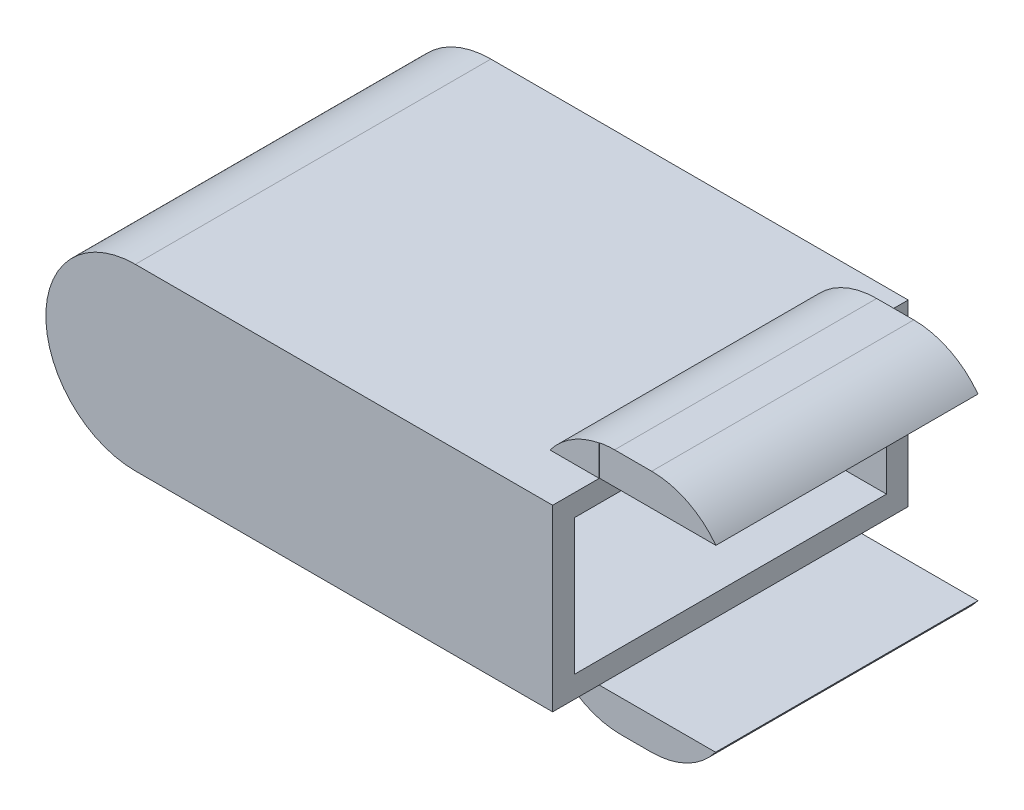
ISO-10303-21;
HEADER;
FILE_DESCRIPTION(('STEP AP214'),'2;1');
FILE_NAME('part.step','',(''),(''),'','','');
FILE_SCHEMA(('AUTOMOTIVE_DESIGN { 1 0 10303 214 1 1 1 1 }'));
ENDSEC;
DATA;
#1=APPLICATION_CONTEXT('core data for automotive mechanical design processes');
#2=APPLICATION_PROTOCOL_DEFINITION('international standard','automotive_design',2000,#1);
#3=PRODUCT_CONTEXT('',#1,'mechanical');
#4=PRODUCT('Part','Part','',(#3));
#5=PRODUCT_RELATED_PRODUCT_CATEGORY('part','',(#4));
#6=PRODUCT_DEFINITION_FORMATION('','',#4);
#7=PRODUCT_DEFINITION_CONTEXT('part definition',#1,'design');
#8=PRODUCT_DEFINITION('design','',#6,#7);
#9=PRODUCT_DEFINITION_SHAPE('','',#8);
#10=(LENGTH_UNIT() NAMED_UNIT(*) SI_UNIT(.MILLI.,.METRE.));
#11=(NAMED_UNIT(*) PLANE_ANGLE_UNIT() SI_UNIT($,.RADIAN.));
#12=(NAMED_UNIT(*) SI_UNIT($,.STERADIAN.) SOLID_ANGLE_UNIT());
#13=UNCERTAINTY_MEASURE_WITH_UNIT(LENGTH_MEASURE(1.E-05),#10,'distance_accuracy_value','');
#14=(GEOMETRIC_REPRESENTATION_CONTEXT(3) GLOBAL_UNCERTAINTY_ASSIGNED_CONTEXT((#13)) GLOBAL_UNIT_ASSIGNED_CONTEXT((#10,
#11,#12)) REPRESENTATION_CONTEXT('',''));
#15=CARTESIAN_POINT('',(0.,0.,0.));
#16=DIRECTION('',(0.,0.,1.));
#17=DIRECTION('',(1.,0.,0.));
#18=AXIS2_PLACEMENT_3D('',#15,#16,#17);
#19=CARTESIAN_POINT('',(18.2408360128617,22.3,-22.15));
#20=DIRECTION('',(-1.,0.,0.));
#21=DIRECTION('',(0.,0.,1.));
#22=AXIS2_PLACEMENT_3D('',#19,#20,#21);
#23=PLANE('',#22);
#24=DIRECTION('',(0.,0.,1.));
#25=VECTOR('',#24,1.);
#26=CARTESIAN_POINT('',(18.2408360128618,19.6,19.45));
#27=LINE('',#26,#25);
#28=CARTESIAN_POINT('',(18.2408360128617,19.6,-19.45));
#29=VERTEX_POINT('',#28);
#30=CARTESIAN_POINT('',(18.2408360128618,19.6,19.45));
#31=VERTEX_POINT('',#30);
#32=EDGE_CURVE('E249',#29,#31,#27,.T.);
#33=ORIENTED_EDGE('',*,*,#32,.F.);
#34=DIRECTION('',(0.,1.,0.));
#35=VECTOR('',#34,1.);
#36=CARTESIAN_POINT('',(18.2408360128617,2.7,-19.45));
#37=LINE('',#36,#35);
#38=CARTESIAN_POINT('',(18.2408360128617,2.7,-19.45));
#39=VERTEX_POINT('',#38);
#40=EDGE_CURVE('E231',#39,#29,#37,.T.);
#41=ORIENTED_EDGE('',*,*,#40,.F.);
#42=DIRECTION('',(0.,0.,-1.));
#43=VECTOR('',#42,1.);
#44=CARTESIAN_POINT('',(18.2408360128618,2.7,19.45));
#45=LINE('',#44,#43);
#46=CARTESIAN_POINT('',(18.2408360128618,2.7,19.45));
#47=VERTEX_POINT('',#46);
#48=EDGE_CURVE('E238',#47,#39,#45,.T.);
#49=ORIENTED_EDGE('',*,*,#48,.F.);
#50=DIRECTION('',(0.,-1.,0.));
#51=VECTOR('',#50,1.);
#52=CARTESIAN_POINT('',(18.2408360128618,2.7,19.45));
#53=LINE('',#52,#51);
#54=EDGE_CURVE('E252',#31,#47,#53,.T.);
#55=ORIENTED_EDGE('',*,*,#54,.F.);
#56=EDGE_LOOP('',(#33,#41,#49,#55));
#57=FACE_BOUND('',#56,.T.);
#58=DIRECTION('',(0.,-1.,0.));
#59=VECTOR('',#58,1.);
#60=CARTESIAN_POINT('',(18.2408360128618,22.3,16.3102911130721));
#61=LINE('',#60,#59);
#62=CARTESIAN_POINT('',(18.2408360128618,26.1221908407786,16.3102911130721));
#63=VERTEX_POINT('',#62);
#64=CARTESIAN_POINT('',(18.2408360128618,22.3,16.3102911130721));
#65=VERTEX_POINT('',#64);
#66=EDGE_CURVE('E185',#63,#65,#61,.T.);
#67=ORIENTED_EDGE('',*,*,#66,.F.);
#68=DIRECTION('',(0.,0.,-1.));
#69=VECTOR('',#68,1.);
#70=CARTESIAN_POINT('',(18.2408360128618,26.1221908407786,16.3102911130721));
#71=LINE('',#70,#69);
#72=CARTESIAN_POINT('',(18.2408360128618,26.1221908407786,16.35));
#73=VERTEX_POINT('',#72);
#74=EDGE_CURVE('E305',#63,#73,#71,.F.);
#75=ORIENTED_EDGE('',*,*,#74,.T.);
#76=DIRECTION('',(0.,-1.,0.));
#77=VECTOR('',#76,1.);
#78=CARTESIAN_POINT('',(18.2408360128618,26.3,16.35));
#79=LINE('',#78,#77);
#80=CARTESIAN_POINT('',(18.2408360128618,22.3,16.35));
#81=VERTEX_POINT('',#80);
#82=EDGE_CURVE('E193',#73,#81,#79,.T.);
#83=ORIENTED_EDGE('',*,*,#82,.T.);
#84=DIRECTION('',(0.,0.,-1.));
#85=VECTOR('',#84,1.);
#86=CARTESIAN_POINT('',(18.2408360128617,22.3,-22.15));
#87=LINE('',#86,#85);
#88=CARTESIAN_POINT('',(18.2408360128618,22.3,22.15));
#89=VERTEX_POINT('',#88);
#90=EDGE_CURVE('E273',#89,#81,#87,.T.);
#91=ORIENTED_EDGE('',*,*,#90,.F.);
#92=DIRECTION('',(0.,-1.,0.));
#93=VECTOR('',#92,1.);
#94=CARTESIAN_POINT('',(18.2408360128618,22.3,22.15));
#95=LINE('',#94,#93);
#96=CARTESIAN_POINT('',(18.2408360128618,0.,22.15));
#97=VERTEX_POINT('',#96);
#98=EDGE_CURVE('E289',#89,#97,#95,.T.);
#99=ORIENTED_EDGE('',*,*,#98,.T.);
#100=DIRECTION('',(0.,0.,-1.));
#101=VECTOR('',#100,1.);
#102=CARTESIAN_POINT('',(18.2408360128617,0.,-22.15));
#103=LINE('',#102,#101);
#104=CARTESIAN_POINT('',(18.2408360128618,0.,16.35));
#105=VERTEX_POINT('',#104);
#106=EDGE_CURVE('E284',#97,#105,#103,.T.);
#107=ORIENTED_EDGE('',*,*,#106,.T.);
#108=DIRECTION('',(0.,0.,1.));
#109=VECTOR('',#108,1.);
#110=CARTESIAN_POINT('',(18.2408360128617,0.,-16.35));
#111=LINE('',#110,#109);
#112=CARTESIAN_POINT('',(18.2408360128618,0.,-16.35));
#113=VERTEX_POINT('',#112);
#114=EDGE_CURVE('E202',#113,#105,#111,.T.);
#115=ORIENTED_EDGE('',*,*,#114,.F.);
#116=CARTESIAN_POINT('',(18.2408360128617,0.,-22.15));
#117=VERTEX_POINT('',#116);
#118=EDGE_CURVE('E283',#113,#117,#103,.T.);
#119=ORIENTED_EDGE('',*,*,#118,.T.);
#120=DIRECTION('',(0.,-1.,0.));
#121=VECTOR('',#120,1.);
#122=CARTESIAN_POINT('',(18.2408360128617,22.3,-22.15));
#123=LINE('',#122,#121);
#124=CARTESIAN_POINT('',(18.2408360128617,22.3,-22.15));
#125=VERTEX_POINT('',#124);
#126=EDGE_CURVE('E278',#125,#117,#123,.T.);
#127=ORIENTED_EDGE('',*,*,#126,.F.);
#128=CARTESIAN_POINT('',(18.2408360128618,22.3,-16.35));
#129=VERTEX_POINT('',#128);
#130=EDGE_CURVE('E272',#129,#125,#87,.T.);
#131=ORIENTED_EDGE('',*,*,#130,.F.);
#132=DIRECTION('',(0.,0.,-1.));
#133=VECTOR('',#132,1.);
#134=CARTESIAN_POINT('',(18.2408360128617,22.3,-16.35));
#135=LINE('',#134,#133);
#136=EDGE_CURVE('E180',#65,#129,#135,.T.);
#137=ORIENTED_EDGE('',*,*,#136,.F.);
#138=EDGE_LOOP('',(#67,#75,#83,#91,#99,#107,#115,#119,#127,#131,#137));
#139=FACE_BOUND('',#138,.T.);
#140=ADVANCED_FACE('F33',(#57,#139),#23,.F.);
#141=CARTESIAN_POINT('',(0.,22.3,0.));
#142=DIRECTION('',(0.,-1.,0.));
#143=DIRECTION('',(0.,0.,-1.));
#144=AXIS2_PLACEMENT_3D('',#141,#142,#143);
#145=PLANE('',#144);
#146=DIRECTION('',(-1.,0.,0.));
#147=VECTOR('',#146,1.);
#148=CARTESIAN_POINT('',(18.2408360128618,22.3,-16.35));
#149=LINE('',#148,#147);
#150=CARTESIAN_POINT('',(12.118219055111,22.3,-16.35));
#151=VERTEX_POINT('',#150);
#152=EDGE_CURVE('E181',#129,#151,#149,.T.);
#153=ORIENTED_EDGE('',*,*,#152,.F.);
#154=ORIENTED_EDGE('',*,*,#130,.T.);
#155=DIRECTION('',(-1.,0.,0.));
#156=VECTOR('',#155,1.);
#157=CARTESIAN_POINT('',(18.2408360128617,22.3,-22.15));
#158=LINE('',#157,#156);
#159=CARTESIAN_POINT('',(-33.7591639871383,22.3,-22.15));
#160=VERTEX_POINT('',#159);
#161=EDGE_CURVE('E276',#125,#160,#158,.T.);
#162=ORIENTED_EDGE('',*,*,#161,.T.);
#163=DIRECTION('',(0.,0.,1.));
#164=VECTOR('',#163,1.);
#165=CARTESIAN_POINT('',(-33.7591639871383,22.3,-22.15));
#166=LINE('',#165,#164);
#167=CARTESIAN_POINT('',(-33.7591639871383,22.3,22.15));
#168=VERTEX_POINT('',#167);
#169=EDGE_CURVE('E266',#160,#168,#166,.T.);
#170=ORIENTED_EDGE('',*,*,#169,.T.);
#171=DIRECTION('',(1.,0.,0.));
#172=VECTOR('',#171,1.);
#173=CARTESIAN_POINT('',(18.2408360128618,22.3,22.15));
#174=LINE('',#173,#172);
#175=EDGE_CURVE('E269',#168,#89,#174,.T.);
#176=ORIENTED_EDGE('',*,*,#175,.T.);
#177=ORIENTED_EDGE('',*,*,#90,.T.);
#178=DIRECTION('',(-1.,0.,0.));
#179=VECTOR('',#178,1.);
#180=CARTESIAN_POINT('',(18.2408360128618,22.3,16.35));
#181=LINE('',#180,#179);
#182=CARTESIAN_POINT('',(12.118219055111,22.3,16.35));
#183=VERTEX_POINT('',#182);
#184=EDGE_CURVE('E194',#81,#183,#181,.T.);
#185=ORIENTED_EDGE('',*,*,#184,.T.);
#186=DIRECTION('',(0.,0.,1.));
#187=VECTOR('',#186,1.);
#188=CARTESIAN_POINT('',(12.118219055111,22.3,-16.35));
#189=LINE('',#188,#187);
#190=EDGE_CURVE('E196',#151,#183,#189,.T.);
#191=ORIENTED_EDGE('',*,*,#190,.F.);
#192=EDGE_LOOP('',(#153,#154,#162,#170,#176,#177,#185,#191));
#193=FACE_BOUND('',#192,.T.);
#194=ADVANCED_FACE('F349',(#193),#145,.F.);
#195=CARTESIAN_POINT('',(0.,0.,0.));
#196=DIRECTION('',(0.,-1.,0.));
#197=DIRECTION('',(0.,0.,-1.));
#198=AXIS2_PLACEMENT_3D('',#195,#196,#197);
#199=PLANE('',#198);
#200=DIRECTION('',(0.,0.,-1.));
#201=VECTOR('',#200,1.);
#202=CARTESIAN_POINT('',(12.9174812634574,0.,-16.35));
#203=LINE('',#202,#201);
#204=CARTESIAN_POINT('',(12.9174812634574,0.,16.35));
#205=VERTEX_POINT('',#204);
#206=CARTESIAN_POINT('',(12.9174812634574,0.,-16.35));
#207=VERTEX_POINT('',#206);
#208=EDGE_CURVE('E223',#205,#207,#203,.T.);
#209=ORIENTED_EDGE('',*,*,#208,.F.);
#210=DIRECTION('',(-1.,0.,0.));
#211=VECTOR('',#210,1.);
#212=CARTESIAN_POINT('',(18.2408360128617,0.,16.35));
#213=LINE('',#212,#211);
#214=EDGE_CURVE('E214',#105,#205,#213,.T.);
#215=ORIENTED_EDGE('',*,*,#214,.F.);
#216=ORIENTED_EDGE('',*,*,#106,.F.);
#217=DIRECTION('',(1.,0.,0.));
#218=VECTOR('',#217,1.);
#219=CARTESIAN_POINT('',(18.2408360128618,0.,22.15));
#220=LINE('',#219,#218);
#221=CARTESIAN_POINT('',(-33.7591639871383,0.,22.15));
#222=VERTEX_POINT('',#221);
#223=EDGE_CURVE('E281',#222,#97,#220,.T.);
#224=ORIENTED_EDGE('',*,*,#223,.F.);
#225=DIRECTION('',(0.,0.,1.));
#226=VECTOR('',#225,1.);
#227=CARTESIAN_POINT('',(-33.7591639871383,0.,-22.15));
#228=LINE('',#227,#226);
#229=CARTESIAN_POINT('',(-33.7591639871383,0.,-22.15));
#230=VERTEX_POINT('',#229);
#231=EDGE_CURVE('E259',#230,#222,#228,.T.);
#232=ORIENTED_EDGE('',*,*,#231,.F.);
#233=DIRECTION('',(-1.,0.,0.));
#234=VECTOR('',#233,1.);
#235=CARTESIAN_POINT('',(18.2408360128617,0.,-22.15));
#236=LINE('',#235,#234);
#237=EDGE_CURVE('E270',#117,#230,#236,.T.);
#238=ORIENTED_EDGE('',*,*,#237,.F.);
#239=ORIENTED_EDGE('',*,*,#118,.F.);
#240=DIRECTION('',(1.,0.,0.));
#241=VECTOR('',#240,1.);
#242=CARTESIAN_POINT('',(18.2408360128618,0.,-16.35));
#243=LINE('',#242,#241);
#244=EDGE_CURVE('E218',#207,#113,#243,.T.);
#245=ORIENTED_EDGE('',*,*,#244,.F.);
#246=EDGE_LOOP('',(#209,#215,#216,#224,#232,#238,#239,#245));
#247=FACE_BOUND('',#246,.T.);
#248=ADVANCED_FACE('F337',(#247),#199,.T.);
#249=CARTESIAN_POINT('',(18.2408360128618,22.3,22.15));
#250=DIRECTION('',(0.,0.,-1.));
#251=DIRECTION('',(-1.,0.,0.));
#252=AXIS2_PLACEMENT_3D('',#249,#250,#251);
#253=PLANE('',#252);
#254=ORIENTED_EDGE('',*,*,#223,.T.);
#255=ORIENTED_EDGE('',*,*,#98,.F.);
#256=ORIENTED_EDGE('',*,*,#175,.F.);
#257=CARTESIAN_POINT('',(-33.7591639871383,11.15,22.15));
#258=DIRECTION('',(0.,0.,1.));
#259=DIRECTION('',(1.,0.,0.));
#260=AXIS2_PLACEMENT_3D('',#257,#258,#259);
#261=CIRCLE('',#260,11.15);
#262=EDGE_CURVE('E221',#168,#222,#261,.T.);
#263=ORIENTED_EDGE('',*,*,#262,.T.);
#264=EDGE_LOOP('',(#254,#255,#256,#263));
#265=FACE_BOUND('',#264,.T.);
#266=ADVANCED_FACE('F354',(#265),#253,.F.);
#267=CARTESIAN_POINT('',(18.2408360128617,22.3,-22.15));
#268=DIRECTION('',(0.,0.,1.));
#269=DIRECTION('',(1.,0.,0.));
#270=AXIS2_PLACEMENT_3D('',#267,#268,#269);
#271=PLANE('',#270);
#272=ORIENTED_EDGE('',*,*,#237,.T.);
#273=CARTESIAN_POINT('',(-33.7591639871383,11.15,-22.15));
#274=DIRECTION('',(0.,0.,1.));
#275=DIRECTION('',(1.,0.,0.));
#276=AXIS2_PLACEMENT_3D('',#273,#274,#275);
#277=CIRCLE('',#276,11.15);
#278=EDGE_CURVE('E228',#160,#230,#277,.T.);
#279=ORIENTED_EDGE('',*,*,#278,.F.);
#280=ORIENTED_EDGE('',*,*,#161,.F.);
#281=ORIENTED_EDGE('',*,*,#126,.T.);
#282=EDGE_LOOP('',(#272,#279,#280,#281));
#283=FACE_BOUND('',#282,.T.);
#284=ADVANCED_FACE('F344',(#283),#271,.F.);
#285=CARTESIAN_POINT('',(-33.7591639871383,2.7,-19.45));
#286=DIRECTION('',(0.,0.,-1.));
#287=DIRECTION('',(0.,1.,0.));
#288=AXIS2_PLACEMENT_3D('',#285,#286,#287);
#289=PLANE('',#288);
#290=ORIENTED_EDGE('',*,*,#40,.T.);
#291=DIRECTION('',(1.,0.,0.));
#292=VECTOR('',#291,1.);
#293=CARTESIAN_POINT('',(-33.7591639871383,19.6,-19.45));
#294=LINE('',#293,#292);
#295=CARTESIAN_POINT('',(-33.7591639871383,19.6,-19.45));
#296=VERTEX_POINT('',#295);
#297=EDGE_CURVE('E247',#296,#29,#294,.T.);
#298=ORIENTED_EDGE('',*,*,#297,.F.);
#299=DIRECTION('',(0.,1.,0.));
#300=VECTOR('',#299,1.);
#301=CARTESIAN_POINT('',(-33.7591639871383,2.7,-19.45));
#302=LINE('',#301,#300);
#303=CARTESIAN_POINT('',(-33.7591639871383,2.7,-19.45));
#304=VERTEX_POINT('',#303);
#305=EDGE_CURVE('E234',#304,#296,#302,.T.);
#306=ORIENTED_EDGE('',*,*,#305,.F.);
#307=DIRECTION('',(1.,0.,0.));
#308=VECTOR('',#307,1.);
#309=CARTESIAN_POINT('',(-33.7591639871383,2.7,-19.45));
#310=LINE('',#309,#308);
#311=EDGE_CURVE('E257',#304,#39,#310,.T.);
#312=ORIENTED_EDGE('',*,*,#311,.T.);
#313=EDGE_LOOP('',(#290,#298,#306,#312));
#314=FACE_BOUND('',#313,.T.);
#315=ADVANCED_FACE('F557',(#314),#289,.F.);
#316=CARTESIAN_POINT('',(-33.7591639871383,2.7,19.45));
#317=DIRECTION('',(0.,-1.,0.));
#318=DIRECTION('',(0.,0.,-1.));
#319=AXIS2_PLACEMENT_3D('',#316,#317,#318);
#320=PLANE('',#319);
#321=ORIENTED_EDGE('',*,*,#48,.T.);
#322=ORIENTED_EDGE('',*,*,#311,.F.);
#323=DIRECTION('',(0.,0.,-1.));
#324=VECTOR('',#323,1.);
#325=CARTESIAN_POINT('',(-33.7591639871383,2.7,19.45));
#326=LINE('',#325,#324);
#327=CARTESIAN_POINT('',(-33.7591639871383,2.7,19.45));
#328=VERTEX_POINT('',#327);
#329=EDGE_CURVE('E244',#328,#304,#326,.T.);
#330=ORIENTED_EDGE('',*,*,#329,.F.);
#331=DIRECTION('',(1.,0.,0.));
#332=VECTOR('',#331,1.);
#333=CARTESIAN_POINT('',(-33.7591639871383,2.7,19.45));
#334=LINE('',#333,#332);
#335=EDGE_CURVE('E260',#328,#47,#334,.T.);
#336=ORIENTED_EDGE('',*,*,#335,.T.);
#337=EDGE_LOOP('',(#321,#322,#330,#336));
#338=FACE_BOUND('',#337,.T.);
#339=ADVANCED_FACE('F547',(#338),#320,.F.);
#340=CARTESIAN_POINT('',(-33.7591639871383,2.7,19.45));
#341=DIRECTION('',(0.,0.,1.));
#342=DIRECTION('',(1.,0.,0.));
#343=AXIS2_PLACEMENT_3D('',#340,#341,#342);
#344=PLANE('',#343);
#345=ORIENTED_EDGE('',*,*,#54,.T.);
#346=ORIENTED_EDGE('',*,*,#335,.F.);
#347=DIRECTION('',(0.,-1.,0.));
#348=VECTOR('',#347,1.);
#349=CARTESIAN_POINT('',(-33.7591639871383,2.7,19.45));
#350=LINE('',#349,#348);
#351=CARTESIAN_POINT('',(-33.7591639871383,19.6,19.45));
#352=VERTEX_POINT('',#351);
#353=EDGE_CURVE('E241',#352,#328,#350,.T.);
#354=ORIENTED_EDGE('',*,*,#353,.F.);
#355=DIRECTION('',(1.,0.,0.));
#356=VECTOR('',#355,1.);
#357=CARTESIAN_POINT('',(-33.7591639871383,19.6,19.45));
#358=LINE('',#357,#356);
#359=EDGE_CURVE('E262',#352,#31,#358,.T.);
#360=ORIENTED_EDGE('',*,*,#359,.T.);
#361=EDGE_LOOP('',(#345,#346,#354,#360));
#362=FACE_BOUND('',#361,.T.);
#363=ADVANCED_FACE('F536',(#362),#344,.F.);
#364=CARTESIAN_POINT('',(-33.7591639871383,19.6,19.45));
#365=DIRECTION('',(0.,1.,0.));
#366=DIRECTION('',(0.,0.,1.));
#367=AXIS2_PLACEMENT_3D('',#364,#365,#366);
#368=PLANE('',#367);
#369=ORIENTED_EDGE('',*,*,#32,.T.);
#370=ORIENTED_EDGE('',*,*,#359,.F.);
#371=DIRECTION('',(0.,0.,1.));
#372=VECTOR('',#371,1.);
#373=CARTESIAN_POINT('',(-33.7591639871383,19.6,19.45));
#374=LINE('',#373,#372);
#375=EDGE_CURVE('E237',#296,#352,#374,.T.);
#376=ORIENTED_EDGE('',*,*,#375,.F.);
#377=ORIENTED_EDGE('',*,*,#297,.T.);
#378=EDGE_LOOP('',(#369,#370,#376,#377));
#379=FACE_BOUND('',#378,.T.);
#380=ADVANCED_FACE('F525',(#379),#368,.F.);
#381=CARTESIAN_POINT('',(-33.7591639871383,22.3,-22.15));
#382=DIRECTION('',(1.,0.,0.));
#383=DIRECTION('',(0.,0.,-1.));
#384=AXIS2_PLACEMENT_3D('',#381,#382,#383);
#385=PLANE('',#384);
#386=ORIENTED_EDGE('',*,*,#305,.T.);
#387=ORIENTED_EDGE('',*,*,#375,.T.);
#388=ORIENTED_EDGE('',*,*,#353,.T.);
#389=ORIENTED_EDGE('',*,*,#329,.T.);
#390=EDGE_LOOP('',(#386,#387,#388,#389));
#391=FACE_BOUND('',#390,.T.);
#392=ADVANCED_FACE('F516',(#391),#385,.T.);
#393=CARTESIAN_POINT('',(-33.7591639871383,11.15,-22.15));
#394=DIRECTION('',(0.,0.,1.));
#395=DIRECTION('',(1.,0.,0.));
#396=AXIS2_PLACEMENT_3D('',#393,#394,#395);
#397=CYLINDRICAL_SURFACE('',#396,11.15);
#398=ORIENTED_EDGE('',*,*,#262,.F.);
#399=ORIENTED_EDGE('',*,*,#169,.F.);
#400=ORIENTED_EDGE('',*,*,#278,.T.);
#401=ORIENTED_EDGE('',*,*,#231,.T.);
#402=EDGE_LOOP('',(#398,#399,#400,#401));
#403=FACE_BOUND('',#402,.T.);
#404=ADVANCED_FACE('F352',(#403),#397,.T.);
#405=CARTESIAN_POINT('',(18.2408360128617,-4.,16.35));
#406=DIRECTION('',(0.,0.,-1.));
#407=DIRECTION('',(-1.,0.,0.));
#408=AXIS2_PLACEMENT_3D('',#405,#406,#407);
#409=PLANE('',#408);
#410=DIRECTION('',(-1.,0.,0.));
#411=VECTOR('',#410,1.);
#412=CARTESIAN_POINT('',(18.2408360128617,-4.,16.35));
#413=LINE('',#412,#411);
#414=CARTESIAN_POINT('',(24.7408360128618,-4.,16.35));
#415=VERTEX_POINT('',#414);
#416=CARTESIAN_POINT('',(20.9174812634574,-4.,16.35));
#417=VERTEX_POINT('',#416);
#418=EDGE_CURVE('E215',#415,#417,#413,.T.);
#419=ORIENTED_EDGE('',*,*,#418,.F.);
#420=CARTESIAN_POINT('',(24.7408360128618,6.,16.35));
#421=DIRECTION('',(0.,0.,-1.));
#422=DIRECTION('',(-1.,0.,0.));
#423=AXIS2_PLACEMENT_3D('',#420,#421,#422);
#424=CIRCLE('',#423,10.);
#425=CARTESIAN_POINT('',(32.7408360128618,0.,16.35));
#426=VERTEX_POINT('',#425);
#427=EDGE_CURVE('E315',#415,#426,#424,.F.);
#428=ORIENTED_EDGE('',*,*,#427,.T.);
#429=DIRECTION('',(-1.,0.,0.));
#430=VECTOR('',#429,1.);
#431=CARTESIAN_POINT('',(32.7408360128618,0.,16.35));
#432=LINE('',#431,#430);
#433=EDGE_CURVE('E211',#426,#105,#432,.T.);
#434=ORIENTED_EDGE('',*,*,#433,.T.);
#435=ORIENTED_EDGE('',*,*,#214,.T.);
#436=CARTESIAN_POINT('',(20.9174812634574,6.,16.35));
#437=DIRECTION('',(0.,0.,-1.));
#438=DIRECTION('',(-1.,0.,0.));
#439=AXIS2_PLACEMENT_3D('',#436,#437,#438);
#440=CIRCLE('',#439,10.);
#441=EDGE_CURVE('E297',#205,#417,#440,.F.);
#442=ORIENTED_EDGE('',*,*,#441,.T.);
#443=EDGE_LOOP('',(#419,#428,#434,#435,#442));
#444=FACE_BOUND('',#443,.T.);
#445=ADVANCED_FACE('F321',(#444),#409,.F.);
#446=CARTESIAN_POINT('',(18.2408360128618,-4.,-16.35));
#447=DIRECTION('',(0.,0.,1.));
#448=DIRECTION('',(1.,0.,0.));
#449=AXIS2_PLACEMENT_3D('',#446,#447,#448);
#450=PLANE('',#449);
#451=DIRECTION('',(-1.,0.,0.));
#452=VECTOR('',#451,1.);
#453=CARTESIAN_POINT('',(32.7408360128617,0.,-16.35));
#454=LINE('',#453,#452);
#455=CARTESIAN_POINT('',(32.7408360128617,0.,-16.35));
#456=VERTEX_POINT('',#455);
#457=EDGE_CURVE('E206',#456,#113,#454,.T.);
#458=ORIENTED_EDGE('',*,*,#457,.F.);
#459=CARTESIAN_POINT('',(24.7408360128618,6.,-16.35));
#460=DIRECTION('',(0.,0.,1.));
#461=DIRECTION('',(1.,0.,0.));
#462=AXIS2_PLACEMENT_3D('',#459,#460,#461);
#463=CIRCLE('',#462,10.);
#464=CARTESIAN_POINT('',(24.7408360128617,-4.,-16.35));
#465=VERTEX_POINT('',#464);
#466=EDGE_CURVE('E311',#456,#465,#463,.F.);
#467=ORIENTED_EDGE('',*,*,#466,.T.);
#468=DIRECTION('',(1.,0.,0.));
#469=VECTOR('',#468,1.);
#470=CARTESIAN_POINT('',(18.2408360128618,-4.,-16.35));
#471=LINE('',#470,#469);
#472=CARTESIAN_POINT('',(20.9174812634574,-4.,-16.35));
#473=VERTEX_POINT('',#472);
#474=EDGE_CURVE('E217',#473,#465,#471,.T.);
#475=ORIENTED_EDGE('',*,*,#474,.F.);
#476=CARTESIAN_POINT('',(20.9174812634574,6.,-16.35));
#477=DIRECTION('',(0.,0.,1.));
#478=DIRECTION('',(1.,0.,0.));
#479=AXIS2_PLACEMENT_3D('',#476,#477,#478);
#480=CIRCLE('',#479,10.);
#481=EDGE_CURVE('E295',#473,#207,#480,.F.);
#482=ORIENTED_EDGE('',*,*,#481,.T.);
#483=ORIENTED_EDGE('',*,*,#244,.T.);
#484=EDGE_LOOP('',(#458,#467,#475,#482,#483));
#485=FACE_BOUND('',#484,.T.);
#486=ADVANCED_FACE('F331',(#485),#450,.F.);
#487=CARTESIAN_POINT('',(0.,-4.,0.));
#488=DIRECTION('',(0.,-1.,0.));
#489=DIRECTION('',(0.,0.,-1.));
#490=AXIS2_PLACEMENT_3D('',#487,#488,#489);
#491=PLANE('',#490);
#492=ORIENTED_EDGE('',*,*,#474,.T.);
#493=DIRECTION('',(0.,0.,1.));
#494=VECTOR('',#493,1.);
#495=CARTESIAN_POINT('',(24.7408360128618,-4.,16.35));
#496=LINE('',#495,#494);
#497=EDGE_CURVE('E313',#465,#415,#496,.T.);
#498=ORIENTED_EDGE('',*,*,#497,.T.);
#499=ORIENTED_EDGE('',*,*,#418,.T.);
#500=DIRECTION('',(0.,0.,1.));
#501=VECTOR('',#500,1.);
#502=CARTESIAN_POINT('',(20.9174812634574,-4.,-16.35));
#503=LINE('',#502,#501);
#504=EDGE_CURVE('E292',#417,#473,#503,.F.);
#505=ORIENTED_EDGE('',*,*,#504,.T.);
#506=EDGE_LOOP('',(#492,#498,#499,#505));
#507=FACE_BOUND('',#506,.T.);
#508=ADVANCED_FACE('F445',(#507),#491,.T.);
#509=CARTESIAN_POINT('',(32.7408360128617,0.,-16.35));
#510=DIRECTION('',(0.,-1.,0.));
#511=DIRECTION('',(0.,0.,-1.));
#512=AXIS2_PLACEMENT_3D('',#509,#510,#511);
#513=PLANE('',#512);
#514=ORIENTED_EDGE('',*,*,#114,.T.);
#515=ORIENTED_EDGE('',*,*,#433,.F.);
#516=DIRECTION('',(0.,0.,1.));
#517=VECTOR('',#516,1.);
#518=CARTESIAN_POINT('',(32.7408360128617,0.,-16.35));
#519=LINE('',#518,#517);
#520=EDGE_CURVE('E203',#456,#426,#519,.T.);
#521=ORIENTED_EDGE('',*,*,#520,.F.);
#522=ORIENTED_EDGE('',*,*,#457,.T.);
#523=EDGE_LOOP('',(#514,#515,#521,#522));
#524=FACE_BOUND('',#523,.T.);
#525=ADVANCED_FACE('F326',(#524),#513,.F.);
#526=CARTESIAN_POINT('',(18.2408360128618,26.3,-16.35));
#527=DIRECTION('',(0.,0.,1.));
#528=DIRECTION('',(1.,0.,0.));
#529=AXIS2_PLACEMENT_3D('',#526,#527,#528);
#530=PLANE('',#529);
#531=DIRECTION('',(-1.,0.,0.));
#532=VECTOR('',#531,1.);
#533=CARTESIAN_POINT('',(18.2408360128618,26.3,-16.35));
#534=LINE('',#533,#532);
#535=CARTESIAN_POINT('',(24.7408360128618,26.3,-16.35));
#536=VERTEX_POINT('',#535);
#537=CARTESIAN_POINT('',(20.118219055111,26.3,-16.35));
#538=VERTEX_POINT('',#537);
#539=EDGE_CURVE('E171',#536,#538,#534,.T.);
#540=ORIENTED_EDGE('',*,*,#539,.F.);
#541=CARTESIAN_POINT('',(24.7408360128618,16.3,-16.35));
#542=DIRECTION('',(0.,0.,1.));
#543=DIRECTION('',(1.,0.,0.));
#544=AXIS2_PLACEMENT_3D('',#541,#542,#543);
#545=CIRCLE('',#544,10.);
#546=CARTESIAN_POINT('',(32.7408360128617,22.3,-16.35));
#547=VERTEX_POINT('',#546);
#548=EDGE_CURVE('E11',#536,#547,#545,.F.);
#549=ORIENTED_EDGE('',*,*,#548,.T.);
#550=DIRECTION('',(-1.,0.,0.));
#551=VECTOR('',#550,1.);
#552=CARTESIAN_POINT('',(32.7408360128617,22.3,-16.35));
#553=LINE('',#552,#551);
#554=EDGE_CURVE('E168',#547,#129,#553,.T.);
#555=ORIENTED_EDGE('',*,*,#554,.T.);
#556=ORIENTED_EDGE('',*,*,#152,.T.);
#557=CARTESIAN_POINT('',(20.118219055111,16.3,-16.35));
#558=DIRECTION('',(0.,0.,1.));
#559=DIRECTION('',(1.,0.,0.));
#560=AXIS2_PLACEMENT_3D('',#557,#558,#559);
#561=CIRCLE('',#560,10.);
#562=EDGE_CURVE('E309',#151,#538,#561,.F.);
#563=ORIENTED_EDGE('',*,*,#562,.T.);
#564=EDGE_LOOP('',(#540,#549,#555,#556,#563));
#565=FACE_BOUND('',#564,.T.);
#566=ADVANCED_FACE('F166',(#565),#530,.F.);
#567=CARTESIAN_POINT('',(18.2408360128618,26.3,16.35));
#568=DIRECTION('',(0.,0.,1.));
#569=DIRECTION('',(1.,0.,0.));
#570=AXIS2_PLACEMENT_3D('',#567,#568,#569);
#571=PLANE('',#570);
#572=ORIENTED_EDGE('',*,*,#82,.F.);
#573=CARTESIAN_POINT('',(20.118219055111,16.3,16.35));
#574=DIRECTION('',(0.,0.,1.));
#575=DIRECTION('',(1.,0.,0.));
#576=AXIS2_PLACEMENT_3D('',#573,#574,#575);
#577=CIRCLE('',#576,10.);
#578=EDGE_CURVE('E307',#73,#183,#577,.T.);
#579=ORIENTED_EDGE('',*,*,#578,.T.);
#580=ORIENTED_EDGE('',*,*,#184,.F.);
#581=EDGE_LOOP('',(#572,#579,#580));
#582=FACE_BOUND('',#581,.T.);
#583=ADVANCED_FACE('F360',(#582),#571,.T.);
#584=CARTESIAN_POINT('',(0.,26.3,0.));
#585=DIRECTION('',(0.,1.,0.));
#586=DIRECTION('',(0.,0.,1.));
#587=AXIS2_PLACEMENT_3D('',#584,#585,#586);
#588=PLANE('',#587);
#589=DIRECTION('',(-1.,0.,0.));
#590=VECTOR('',#589,1.);
#591=CARTESIAN_POINT('',(32.7408360128618,26.3,16.3102911130721));
#592=LINE('',#591,#590);
#593=CARTESIAN_POINT('',(24.7408360128618,26.3,16.3102911130721));
#594=VERTEX_POINT('',#593);
#595=CARTESIAN_POINT('',(20.118219055111,26.3,16.3102911130721));
#596=VERTEX_POINT('',#595);
#597=EDGE_CURVE('E182',#594,#596,#592,.T.);
#598=ORIENTED_EDGE('',*,*,#597,.F.);
#599=DIRECTION('',(0.,0.,1.));
#600=VECTOR('',#599,1.);
#601=CARTESIAN_POINT('',(24.7408360128618,26.3,-16.35));
#602=LINE('',#601,#600);
#603=EDGE_CURVE('E41',#594,#536,#602,.F.);
#604=ORIENTED_EDGE('',*,*,#603,.T.);
#605=ORIENTED_EDGE('',*,*,#539,.T.);
#606=DIRECTION('',(0.,0.,1.));
#607=VECTOR('',#606,1.);
#608=CARTESIAN_POINT('',(20.118219055111,26.3,16.35));
#609=LINE('',#608,#607);
#610=EDGE_CURVE('E300',#538,#596,#609,.T.);
#611=ORIENTED_EDGE('',*,*,#610,.T.);
#612=EDGE_LOOP('',(#598,#604,#605,#611));
#613=FACE_BOUND('',#612,.T.);
#614=ADVANCED_FACE('F368',(#613),#588,.T.);
#615=CARTESIAN_POINT('',(32.7408360128617,22.3,-16.35));
#616=DIRECTION('',(0.,1.,0.));
#617=DIRECTION('',(0.,0.,1.));
#618=AXIS2_PLACEMENT_3D('',#615,#616,#617);
#619=PLANE('',#618);
#620=ORIENTED_EDGE('',*,*,#136,.T.);
#621=ORIENTED_EDGE('',*,*,#554,.F.);
#622=DIRECTION('',(0.,0.,-1.));
#623=VECTOR('',#622,1.);
#624=CARTESIAN_POINT('',(32.7408360128617,22.3,-16.35));
#625=LINE('',#624,#623);
#626=CARTESIAN_POINT('',(32.7408360128618,22.3,16.3102911130721));
#627=VERTEX_POINT('',#626);
#628=EDGE_CURVE('E178',#627,#547,#625,.T.);
#629=ORIENTED_EDGE('',*,*,#628,.F.);
#630=DIRECTION('',(-1.,0.,0.));
#631=VECTOR('',#630,1.);
#632=CARTESIAN_POINT('',(32.7408360128618,22.3,16.3102911130721));
#633=LINE('',#632,#631);
#634=EDGE_CURVE('E184',#627,#65,#633,.T.);
#635=ORIENTED_EDGE('',*,*,#634,.T.);
#636=EDGE_LOOP('',(#620,#621,#629,#635));
#637=FACE_BOUND('',#636,.T.);
#638=ADVANCED_FACE('F176',(#637),#619,.F.);
#639=CARTESIAN_POINT('',(32.7408360128618,22.3,16.3102911130721));
#640=DIRECTION('',(0.,0.,-1.));
#641=DIRECTION('',(-1.,0.,0.));
#642=AXIS2_PLACEMENT_3D('',#639,#640,#641);
#643=PLANE('',#642);
#644=ORIENTED_EDGE('',*,*,#634,.F.);
#645=CARTESIAN_POINT('',(24.7408360128618,16.3,16.3102911130721));
#646=DIRECTION('',(0.,0.,-1.));
#647=DIRECTION('',(-1.,0.,0.));
#648=AXIS2_PLACEMENT_3D('',#645,#646,#647);
#649=CIRCLE('',#648,10.);
#650=EDGE_CURVE('E55',#627,#594,#649,.F.);
#651=ORIENTED_EDGE('',*,*,#650,.T.);
#652=ORIENTED_EDGE('',*,*,#597,.T.);
#653=CARTESIAN_POINT('',(20.118219055111,16.3,16.3102911130721));
#654=DIRECTION('',(0.,0.,-1.));
#655=DIRECTION('',(-1.,0.,0.));
#656=AXIS2_PLACEMENT_3D('',#653,#654,#655);
#657=CIRCLE('',#656,10.);
#658=EDGE_CURVE('E303',#596,#63,#657,.F.);
#659=ORIENTED_EDGE('',*,*,#658,.T.);
#660=ORIENTED_EDGE('',*,*,#66,.T.);
#661=EDGE_LOOP('',(#644,#651,#652,#659,#660));
#662=FACE_BOUND('',#661,.T.);
#663=ADVANCED_FACE('F369',(#662),#643,.F.);
#664=CARTESIAN_POINT('',(20.9174812634574,6.,-16.35));
#665=DIRECTION('',(0.,0.,-1.));
#666=DIRECTION('',(-1.,0.,0.));
#667=AXIS2_PLACEMENT_3D('',#664,#665,#666);
#668=CYLINDRICAL_SURFACE('',#667,10.);
#669=ORIENTED_EDGE('',*,*,#441,.F.);
#670=ORIENTED_EDGE('',*,*,#208,.T.);
#671=ORIENTED_EDGE('',*,*,#481,.F.);
#672=ORIENTED_EDGE('',*,*,#504,.F.);
#673=EDGE_LOOP('',(#669,#670,#671,#672));
#674=FACE_BOUND('',#673,.T.);
#675=ADVANCED_FACE('F371',(#674),#668,.T.);
#676=CARTESIAN_POINT('',(20.118219055111,16.3,-16.35));
#677=DIRECTION('',(0.,0.,-1.));
#678=DIRECTION('',(-1.,0.,0.));
#679=AXIS2_PLACEMENT_3D('',#676,#677,#678);
#680=CYLINDRICAL_SURFACE('',#679,10.);
#681=ORIENTED_EDGE('',*,*,#562,.F.);
#682=ORIENTED_EDGE('',*,*,#190,.T.);
#683=ORIENTED_EDGE('',*,*,#578,.F.);
#684=ORIENTED_EDGE('',*,*,#74,.F.);
#685=ORIENTED_EDGE('',*,*,#658,.F.);
#686=ORIENTED_EDGE('',*,*,#610,.F.);
#687=EDGE_LOOP('',(#681,#682,#683,#684,#685,#686));
#688=FACE_BOUND('',#687,.T.);
#689=ADVANCED_FACE('F365',(#688),#680,.T.);
#690=CARTESIAN_POINT('',(24.7408360128618,6.,0.));
#691=DIRECTION('',(0.,0.,-1.));
#692=DIRECTION('',(-1.,0.,0.));
#693=AXIS2_PLACEMENT_3D('',#690,#691,#692);
#694=CYLINDRICAL_SURFACE('',#693,10.);
#695=ORIENTED_EDGE('',*,*,#427,.F.);
#696=ORIENTED_EDGE('',*,*,#497,.F.);
#697=ORIENTED_EDGE('',*,*,#466,.F.);
#698=ORIENTED_EDGE('',*,*,#520,.T.);
#699=EDGE_LOOP('',(#695,#696,#697,#698));
#700=FACE_BOUND('',#699,.T.);
#701=ADVANCED_FACE('F327',(#700),#694,.T.);
#702=CARTESIAN_POINT('',(24.7408360128618,16.3,0.));
#703=DIRECTION('',(0.,0.,-1.));
#704=DIRECTION('',(-1.,0.,0.));
#705=AXIS2_PLACEMENT_3D('',#702,#703,#704);
#706=CYLINDRICAL_SURFACE('',#705,10.);
#707=ORIENTED_EDGE('',*,*,#548,.F.);
#708=ORIENTED_EDGE('',*,*,#603,.F.);
#709=ORIENTED_EDGE('',*,*,#650,.F.);
#710=ORIENTED_EDGE('',*,*,#628,.T.);
#711=EDGE_LOOP('',(#707,#708,#709,#710));
#712=FACE_BOUND('',#711,.T.);
#713=ADVANCED_FACE('F35',(#712),#706,.T.);
#714=CLOSED_SHELL('',(#140,#194,#248,#266,#284,#315,#339,#363,#380,#392,#404,#445,#486,#508,
#525,#566,#583,#614,#638,#663,#675,#689,#701,#713));
#715=MANIFOLD_SOLID_BREP('B2',#714);
#716=ADVANCED_BREP_SHAPE_REPRESENTATION('',(#18,#715),#14);
#717=SHAPE_DEFINITION_REPRESENTATION(#9,#716);
ENDSEC;
END-ISO-10303-21;
